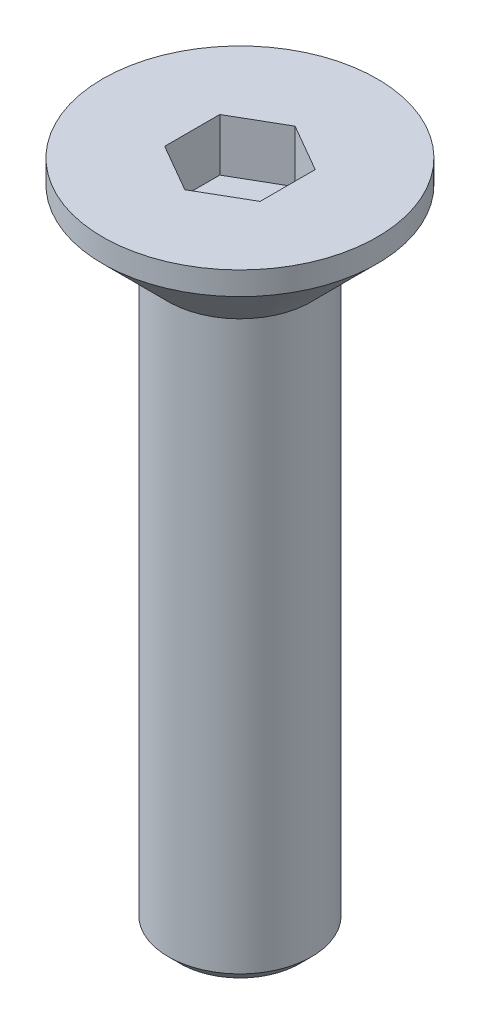
ISO-10303-21;
HEADER;
FILE_DESCRIPTION(('STEP AP214'),'2;1');
FILE_NAME('part.step','',(''),(''),'','','');
FILE_SCHEMA(('AUTOMOTIVE_DESIGN { 1 0 10303 214 1 1 1 1 }'));
ENDSEC;
DATA;
#1=APPLICATION_CONTEXT('core data for automotive mechanical design processes');
#2=APPLICATION_PROTOCOL_DEFINITION('international standard','automotive_design',2000,#1);
#3=PRODUCT_CONTEXT('',#1,'mechanical');
#4=PRODUCT('Part','Part','',(#3));
#5=PRODUCT_RELATED_PRODUCT_CATEGORY('part','',(#4));
#6=PRODUCT_DEFINITION_FORMATION('','',#4);
#7=PRODUCT_DEFINITION_CONTEXT('part definition',#1,'design');
#8=PRODUCT_DEFINITION('design','',#6,#7);
#9=PRODUCT_DEFINITION_SHAPE('','',#8);
#10=(LENGTH_UNIT() NAMED_UNIT(*) SI_UNIT(.MILLI.,.METRE.));
#11=(NAMED_UNIT(*) PLANE_ANGLE_UNIT() SI_UNIT($,.RADIAN.));
#12=(NAMED_UNIT(*) SI_UNIT($,.STERADIAN.) SOLID_ANGLE_UNIT());
#13=UNCERTAINTY_MEASURE_WITH_UNIT(LENGTH_MEASURE(1.E-05),#10,'distance_accuracy_value','');
#14=(GEOMETRIC_REPRESENTATION_CONTEXT(3) GLOBAL_UNCERTAINTY_ASSIGNED_CONTEXT((#13)) GLOBAL_UNIT_ASSIGNED_CONTEXT((#10,
#11,#12)) REPRESENTATION_CONTEXT('',''));
#15=CARTESIAN_POINT('',(0.,0.,0.));
#16=DIRECTION('',(0.,0.,1.));
#17=DIRECTION('',(1.,0.,0.));
#18=AXIS2_PLACEMENT_3D('',#15,#16,#17);
#19=CARTESIAN_POINT('',(0.,0.,0.));
#20=DIRECTION('',(0.,1.,0.));
#21=DIRECTION('',(-1.,0.,0.));
#22=AXIS2_PLACEMENT_3D('',#19,#20,#21);
#23=PLANE('',#22);
#24=DIRECTION('',(-0.866025403784438,0.,0.5));
#25=VECTOR('',#24,1.);
#26=CARTESIAN_POINT('',(0.,0.,-1.15470053837925));
#27=LINE('',#26,#25);
#28=CARTESIAN_POINT('',(0.,0.,-1.15470053837925));
#29=VERTEX_POINT('',#28);
#30=CARTESIAN_POINT('',(-1.,0.,-0.577350269189625));
#31=VERTEX_POINT('',#30);
#32=EDGE_CURVE('E50',#29,#31,#27,.T.);
#33=ORIENTED_EDGE('',*,*,#32,.F.);
#34=DIRECTION('',(-0.866025403784439,0.,-0.5));
#35=VECTOR('',#34,1.);
#36=CARTESIAN_POINT('',(1.,0.,-0.577350269189626));
#37=LINE('',#36,#35);
#38=CARTESIAN_POINT('',(1.,0.,-0.577350269189626));
#39=VERTEX_POINT('',#38);
#40=EDGE_CURVE('E133',#39,#29,#37,.T.);
#41=ORIENTED_EDGE('',*,*,#40,.F.);
#42=DIRECTION('',(0.,0.,-1.));
#43=VECTOR('',#42,1.);
#44=CARTESIAN_POINT('',(1.,0.,0.577350269189625));
#45=LINE('',#44,#43);
#46=CARTESIAN_POINT('',(1.,0.,0.577350269189625));
#47=VERTEX_POINT('',#46);
#48=EDGE_CURVE('E131',#47,#39,#45,.T.);
#49=ORIENTED_EDGE('',*,*,#48,.F.);
#50=DIRECTION('',(0.866025403784438,0.,-0.5));
#51=VECTOR('',#50,1.);
#52=CARTESIAN_POINT('',(0.,0.,1.15470053837925));
#53=LINE('',#52,#51);
#54=CARTESIAN_POINT('',(0.,0.,1.15470053837925));
#55=VERTEX_POINT('',#54);
#56=EDGE_CURVE('E98',#55,#47,#53,.T.);
#57=ORIENTED_EDGE('',*,*,#56,.F.);
#58=DIRECTION('',(0.866025403784439,0.,0.5));
#59=VECTOR('',#58,1.);
#60=CARTESIAN_POINT('',(-1.,0.,0.577350269189626));
#61=LINE('',#60,#59);
#62=CARTESIAN_POINT('',(-1.,0.,0.577350269189626));
#63=VERTEX_POINT('',#62);
#64=EDGE_CURVE('E127',#63,#55,#61,.T.);
#65=ORIENTED_EDGE('',*,*,#64,.F.);
#66=DIRECTION('',(0.,0.,1.));
#67=VECTOR('',#66,1.);
#68=CARTESIAN_POINT('',(-1.,0.,-0.577350269189625));
#69=LINE('',#68,#67);
#70=EDGE_CURVE('E124',#31,#63,#69,.T.);
#71=ORIENTED_EDGE('',*,*,#70,.F.);
#72=EDGE_LOOP('',(#33,#41,#49,#57,#65,#71));
#73=FACE_BOUND('',#72,.T.);
#74=CARTESIAN_POINT('',(0.,0.,0.));
#75=DIRECTION('',(0.,1.,0.));
#76=DIRECTION('',(-1.,0.,0.));
#77=AXIS2_PLACEMENT_3D('',#74,#75,#76);
#78=CIRCLE('',#77,2.875);
#79=CARTESIAN_POINT('',(-2.875,0.,0.));
#80=VERTEX_POINT('',#79);
#81=EDGE_CURVE('E11',#80,#80,#78,.T.);
#82=ORIENTED_EDGE('',*,*,#81,.T.);
#83=EDGE_LOOP('',(#82));
#84=FACE_BOUND('',#83,.T.);
#85=ADVANCED_FACE('F36',(#73,#84),#23,.T.);
#86=CARTESIAN_POINT('',(0.,0.,0.));
#87=DIRECTION('',(0.,1.,0.));
#88=DIRECTION('',(-1.,0.,0.));
#89=AXIS2_PLACEMENT_3D('',#86,#87,#88);
#90=CYLINDRICAL_SURFACE('',#89,2.875);
#91=CARTESIAN_POINT('',(0.,-0.485000000000006,0.));
#92=DIRECTION('',(0.,1.,0.));
#93=DIRECTION('',(-1.,0.,0.));
#94=AXIS2_PLACEMENT_3D('',#91,#92,#93);
#95=CIRCLE('',#94,2.875);
#96=CARTESIAN_POINT('',(-2.875,-0.485000000000006,0.));
#97=VERTEX_POINT('',#96);
#98=EDGE_CURVE('E43',#97,#97,#95,.T.);
#99=ORIENTED_EDGE('',*,*,#98,.T.);
#100=EDGE_LOOP('',(#99));
#101=FACE_BOUND('',#100,.T.);
#102=ORIENTED_EDGE('',*,*,#81,.F.);
#103=EDGE_LOOP('',(#102));
#104=FACE_BOUND('',#103,.T.);
#105=ADVANCED_FACE('F153',(#101,#104),#90,.T.);
#106=CARTESIAN_POINT('',(0.,-0.485000000000006,0.));
#107=DIRECTION('',(0.,1.,0.));
#108=DIRECTION('',(-1.,0.,0.));
#109=AXIS2_PLACEMENT_3D('',#106,#107,#108);
#110=CONICAL_SURFACE('',#109,2.875,0.78539816339745);
#111=CARTESIAN_POINT('',(0.,-1.86,0.));
#112=DIRECTION('',(0.,1.,0.));
#113=DIRECTION('',(-1.,0.,0.));
#114=AXIS2_PLACEMENT_3D('',#111,#112,#113);
#115=CIRCLE('',#114,1.5);
#116=CARTESIAN_POINT('',(-1.5,-1.86,0.));
#117=VERTEX_POINT('',#116);
#118=EDGE_CURVE('E148',#117,#117,#115,.T.);
#119=ORIENTED_EDGE('',*,*,#118,.T.);
#120=EDGE_LOOP('',(#119));
#121=FACE_BOUND('',#120,.T.);
#122=ORIENTED_EDGE('',*,*,#98,.F.);
#123=EDGE_LOOP('',(#122));
#124=FACE_BOUND('',#123,.T.);
#125=ADVANCED_FACE('F156',(#121,#124),#110,.T.);
#126=CARTESIAN_POINT('',(0.,0.,0.));
#127=DIRECTION('',(0.,1.,0.));
#128=DIRECTION('',(-1.,0.,0.));
#129=AXIS2_PLACEMENT_3D('',#126,#127,#128);
#130=CYLINDRICAL_SURFACE('',#129,1.5);
#131=CARTESIAN_POINT('',(0.,-13.75,0.));
#132=DIRECTION('',(0.,1.,0.));
#133=DIRECTION('',(-1.,0.,0.));
#134=AXIS2_PLACEMENT_3D('',#131,#132,#133);
#135=CIRCLE('',#134,1.5);
#136=CARTESIAN_POINT('',(-1.5,-13.75,0.));
#137=VERTEX_POINT('',#136);
#138=EDGE_CURVE('E145',#137,#137,#135,.T.);
#139=ORIENTED_EDGE('',*,*,#138,.T.);
#140=EDGE_LOOP('',(#139));
#141=FACE_BOUND('',#140,.T.);
#142=ORIENTED_EDGE('',*,*,#118,.F.);
#143=EDGE_LOOP('',(#142));
#144=FACE_BOUND('',#143,.T.);
#145=ADVANCED_FACE('F158',(#141,#144),#130,.T.);
#146=CARTESIAN_POINT('',(0.,-13.75,0.));
#147=DIRECTION('',(0.,1.,0.));
#148=DIRECTION('',(-1.,0.,0.));
#149=AXIS2_PLACEMENT_3D('',#146,#147,#148);
#150=CONICAL_SURFACE('',#149,1.5,0.785398163397451);
#151=CARTESIAN_POINT('',(0.,-14.,0.));
#152=DIRECTION('',(0.,1.,0.));
#153=DIRECTION('',(-1.,0.,0.));
#154=AXIS2_PLACEMENT_3D('',#151,#152,#153);
#155=CIRCLE('',#154,1.25);
#156=CARTESIAN_POINT('',(-1.25,-14.,0.));
#157=VERTEX_POINT('',#156);
#158=EDGE_CURVE('E137',#157,#157,#155,.T.);
#159=ORIENTED_EDGE('',*,*,#158,.T.);
#160=EDGE_LOOP('',(#159));
#161=FACE_BOUND('',#160,.T.);
#162=ORIENTED_EDGE('',*,*,#138,.F.);
#163=EDGE_LOOP('',(#162));
#164=FACE_BOUND('',#163,.T.);
#165=ADVANCED_FACE('F165',(#161,#164),#150,.T.);
#166=CARTESIAN_POINT('',(-1.25,-14.,0.));
#167=DIRECTION('',(0.,-1.,0.));
#168=DIRECTION('',(1.,0.,0.));
#169=AXIS2_PLACEMENT_3D('',#166,#167,#168);
#170=PLANE('',#169);
#171=ORIENTED_EDGE('',*,*,#158,.F.);
#172=EDGE_LOOP('',(#171));
#173=FACE_BOUND('',#172,.T.);
#174=ADVANCED_FACE('F183',(#173),#170,.T.);
#175=CARTESIAN_POINT('',(0.,-1.1,-1.15470053837925));
#176=DIRECTION('',(-0.5,0.,-0.866025403784438));
#177=DIRECTION('',(-0.866025403784438,0.,0.5));
#178=AXIS2_PLACEMENT_3D('',#175,#176,#177);
#179=PLANE('',#178);
#180=ORIENTED_EDGE('',*,*,#32,.T.);
#181=DIRECTION('',(0.,1.,0.));
#182=VECTOR('',#181,1.);
#183=CARTESIAN_POINT('',(-1.,-1.1,-0.577350269189625));
#184=LINE('',#183,#182);
#185=CARTESIAN_POINT('',(-1.,-1.1,-0.577350269189625));
#186=VERTEX_POINT('',#185);
#187=EDGE_CURVE('E80',#186,#31,#184,.T.);
#188=ORIENTED_EDGE('',*,*,#187,.F.);
#189=DIRECTION('',(-0.866025403784438,0.,0.5));
#190=VECTOR('',#189,1.);
#191=CARTESIAN_POINT('',(0.,-1.1,-1.15470053837925));
#192=LINE('',#191,#190);
#193=CARTESIAN_POINT('',(0.,-1.1,-1.15470053837925));
#194=VERTEX_POINT('',#193);
#195=EDGE_CURVE('E135',#194,#186,#192,.T.);
#196=ORIENTED_EDGE('',*,*,#195,.F.);
#197=DIRECTION('',(0.,1.,0.));
#198=VECTOR('',#197,1.);
#199=CARTESIAN_POINT('',(0.,-1.1,-1.15470053837925));
#200=LINE('',#199,#198);
#201=EDGE_CURVE('E58',#194,#29,#200,.T.);
#202=ORIENTED_EDGE('',*,*,#201,.T.);
#203=EDGE_LOOP('',(#180,#188,#196,#202));
#204=FACE_BOUND('',#203,.T.);
#205=ADVANCED_FACE('F180',(#204),#179,.F.);
#206=CARTESIAN_POINT('',(1.,-1.1,-0.577350269189626));
#207=DIRECTION('',(0.5,0.,-0.866025403784439));
#208=DIRECTION('',(-0.866025403784439,0.,-0.5));
#209=AXIS2_PLACEMENT_3D('',#206,#207,#208);
#210=PLANE('',#209);
#211=ORIENTED_EDGE('',*,*,#40,.T.);
#212=ORIENTED_EDGE('',*,*,#201,.F.);
#213=DIRECTION('',(-0.866025403784439,0.,-0.5));
#214=VECTOR('',#213,1.);
#215=CARTESIAN_POINT('',(1.,-1.1,-0.577350269189626));
#216=LINE('',#215,#214);
#217=CARTESIAN_POINT('',(1.,-1.1,-0.577350269189626));
#218=VERTEX_POINT('',#217);
#219=EDGE_CURVE('E110',#218,#194,#216,.T.);
#220=ORIENTED_EDGE('',*,*,#219,.F.);
#221=DIRECTION('',(0.,1.,0.));
#222=VECTOR('',#221,1.);
#223=CARTESIAN_POINT('',(1.,-1.1,-0.577350269189626));
#224=LINE('',#223,#222);
#225=EDGE_CURVE('E102',#218,#39,#224,.T.);
#226=ORIENTED_EDGE('',*,*,#225,.T.);
#227=EDGE_LOOP('',(#211,#212,#220,#226));
#228=FACE_BOUND('',#227,.T.);
#229=ADVANCED_FACE('F182',(#228),#210,.F.);
#230=CARTESIAN_POINT('',(1.,-1.1,0.577350269189625));
#231=DIRECTION('',(1.,0.,0.));
#232=DIRECTION('',(0.,0.,-1.));
#233=AXIS2_PLACEMENT_3D('',#230,#231,#232);
#234=PLANE('',#233);
#235=ORIENTED_EDGE('',*,*,#48,.T.);
#236=ORIENTED_EDGE('',*,*,#225,.F.);
#237=DIRECTION('',(0.,0.,-1.));
#238=VECTOR('',#237,1.);
#239=CARTESIAN_POINT('',(1.,-1.1,0.577350269189625));
#240=LINE('',#239,#238);
#241=CARTESIAN_POINT('',(1.,-1.1,0.577350269189625));
#242=VERTEX_POINT('',#241);
#243=EDGE_CURVE('E106',#242,#218,#240,.T.);
#244=ORIENTED_EDGE('',*,*,#243,.F.);
#245=DIRECTION('',(0.,1.,0.));
#246=VECTOR('',#245,1.);
#247=CARTESIAN_POINT('',(1.,-1.1,0.577350269189625));
#248=LINE('',#247,#246);
#249=EDGE_CURVE('E91',#242,#47,#248,.T.);
#250=ORIENTED_EDGE('',*,*,#249,.T.);
#251=EDGE_LOOP('',(#235,#236,#244,#250));
#252=FACE_BOUND('',#251,.T.);
#253=ADVANCED_FACE('F107',(#252),#234,.F.);
#254=CARTESIAN_POINT('',(0.,-1.1,1.15470053837925));
#255=DIRECTION('',(0.5,0.,0.866025403784438));
#256=DIRECTION('',(0.866025403784438,0.,-0.5));
#257=AXIS2_PLACEMENT_3D('',#254,#255,#256);
#258=PLANE('',#257);
#259=ORIENTED_EDGE('',*,*,#56,.T.);
#260=ORIENTED_EDGE('',*,*,#249,.F.);
#261=DIRECTION('',(0.866025403784438,0.,-0.5));
#262=VECTOR('',#261,1.);
#263=CARTESIAN_POINT('',(0.,-1.1,1.15470053837925));
#264=LINE('',#263,#262);
#265=CARTESIAN_POINT('',(0.,-1.1,1.15470053837925));
#266=VERTEX_POINT('',#265);
#267=EDGE_CURVE('E95',#266,#242,#264,.T.);
#268=ORIENTED_EDGE('',*,*,#267,.F.);
#269=DIRECTION('',(0.,1.,0.));
#270=VECTOR('',#269,1.);
#271=CARTESIAN_POINT('',(0.,-1.1,1.15470053837925));
#272=LINE('',#271,#270);
#273=EDGE_CURVE('E103',#266,#55,#272,.T.);
#274=ORIENTED_EDGE('',*,*,#273,.T.);
#275=EDGE_LOOP('',(#259,#260,#268,#274));
#276=FACE_BOUND('',#275,.T.);
#277=ADVANCED_FACE('F93',(#276),#258,.F.);
#278=CARTESIAN_POINT('',(-1.,-1.1,0.577350269189626));
#279=DIRECTION('',(-0.5,0.,0.866025403784438));
#280=DIRECTION('',(0.866025403784439,0.,0.5));
#281=AXIS2_PLACEMENT_3D('',#278,#279,#280);
#282=PLANE('',#281);
#283=ORIENTED_EDGE('',*,*,#64,.T.);
#284=ORIENTED_EDGE('',*,*,#273,.F.);
#285=DIRECTION('',(0.866025403784439,0.,0.5));
#286=VECTOR('',#285,1.);
#287=CARTESIAN_POINT('',(-1.,-1.1,0.577350269189626));
#288=LINE('',#287,#286);
#289=CARTESIAN_POINT('',(-1.,-1.1,0.577350269189626));
#290=VERTEX_POINT('',#289);
#291=EDGE_CURVE('E116',#290,#266,#288,.T.);
#292=ORIENTED_EDGE('',*,*,#291,.F.);
#293=DIRECTION('',(0.,1.,0.));
#294=VECTOR('',#293,1.);
#295=CARTESIAN_POINT('',(-1.,-1.1,0.577350269189626));
#296=LINE('',#295,#294);
#297=EDGE_CURVE('E140',#290,#63,#296,.T.);
#298=ORIENTED_EDGE('',*,*,#297,.T.);
#299=EDGE_LOOP('',(#283,#284,#292,#298));
#300=FACE_BOUND('',#299,.T.);
#301=ADVANCED_FACE('F242',(#300),#282,.F.);
#302=CARTESIAN_POINT('',(-1.,-1.1,-0.577350269189625));
#303=DIRECTION('',(-1.,0.,0.));
#304=DIRECTION('',(0.,-1.,0.));
#305=AXIS2_PLACEMENT_3D('',#302,#303,#304);
#306=PLANE('',#305);
#307=ORIENTED_EDGE('',*,*,#70,.T.);
#308=ORIENTED_EDGE('',*,*,#297,.F.);
#309=DIRECTION('',(0.,0.,1.));
#310=VECTOR('',#309,1.);
#311=CARTESIAN_POINT('',(-1.,-1.1,-0.577350269189625));
#312=LINE('',#311,#310);
#313=EDGE_CURVE('E118',#186,#290,#312,.T.);
#314=ORIENTED_EDGE('',*,*,#313,.F.);
#315=ORIENTED_EDGE('',*,*,#187,.T.);
#316=EDGE_LOOP('',(#307,#308,#314,#315));
#317=FACE_BOUND('',#316,.T.);
#318=ADVANCED_FACE('F178',(#317),#306,.F.);
#319=CARTESIAN_POINT('',(0.,-1.1,0.));
#320=DIRECTION('',(0.,1.,0.));
#321=DIRECTION('',(-1.,0.,0.));
#322=AXIS2_PLACEMENT_3D('',#319,#320,#321);
#323=PLANE('',#322);
#324=ORIENTED_EDGE('',*,*,#195,.T.);
#325=ORIENTED_EDGE('',*,*,#313,.T.);
#326=ORIENTED_EDGE('',*,*,#291,.T.);
#327=ORIENTED_EDGE('',*,*,#267,.T.);
#328=ORIENTED_EDGE('',*,*,#243,.T.);
#329=ORIENTED_EDGE('',*,*,#219,.T.);
#330=EDGE_LOOP('',(#324,#325,#326,#327,#328,#329));
#331=FACE_BOUND('',#330,.T.);
#332=ADVANCED_FACE('F113',(#331),#323,.T.);
#333=CLOSED_SHELL('',(#85,#105,#125,#145,#165,#174,#205,#229,#253,#277,#301,#318,#332));
#334=MANIFOLD_SOLID_BREP('B2',#333);
#335=ADVANCED_BREP_SHAPE_REPRESENTATION('',(#18,#334),#14);
#336=SHAPE_DEFINITION_REPRESENTATION(#9,#335);
ENDSEC;
END-ISO-10303-21;
